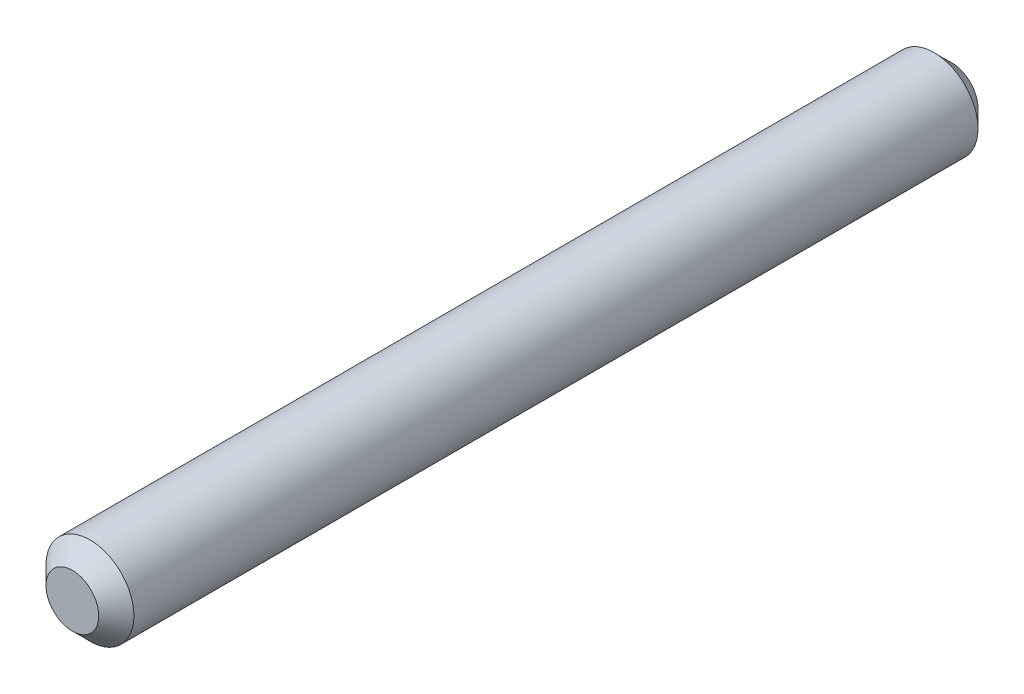
ISO-10303-21;
HEADER;
FILE_DESCRIPTION(('STEP AP214'),'2;1');
FILE_NAME('part.step','',(''),(''),'','','');
FILE_SCHEMA(('AUTOMOTIVE_DESIGN { 1 0 10303 214 1 1 1 1 }'));
ENDSEC;
DATA;
#1=APPLICATION_CONTEXT('core data for automotive mechanical design processes');
#2=APPLICATION_PROTOCOL_DEFINITION('international standard','automotive_design',2000,#1);
#3=PRODUCT_CONTEXT('',#1,'mechanical');
#4=PRODUCT('Part','Part','',(#3));
#5=PRODUCT_RELATED_PRODUCT_CATEGORY('part','',(#4));
#6=PRODUCT_DEFINITION_FORMATION('','',#4);
#7=PRODUCT_DEFINITION_CONTEXT('part definition',#1,'design');
#8=PRODUCT_DEFINITION('design','',#6,#7);
#9=PRODUCT_DEFINITION_SHAPE('','',#8);
#10=(LENGTH_UNIT() NAMED_UNIT(*) SI_UNIT(.MILLI.,.METRE.));
#11=(NAMED_UNIT(*) PLANE_ANGLE_UNIT() SI_UNIT($,.RADIAN.));
#12=(NAMED_UNIT(*) SI_UNIT($,.STERADIAN.) SOLID_ANGLE_UNIT());
#13=UNCERTAINTY_MEASURE_WITH_UNIT(LENGTH_MEASURE(1.E-05),#10,'distance_accuracy_value','');
#14=(GEOMETRIC_REPRESENTATION_CONTEXT(3) GLOBAL_UNCERTAINTY_ASSIGNED_CONTEXT((#13)) GLOBAL_UNIT_ASSIGNED_CONTEXT((#10,
#11,#12)) REPRESENTATION_CONTEXT('',''));
#15=CARTESIAN_POINT('',(0.,0.,0.));
#16=DIRECTION('',(0.,0.,1.));
#17=DIRECTION('',(1.,0.,0.));
#18=AXIS2_PLACEMENT_3D('',#15,#16,#17);
#19=CARTESIAN_POINT('',(0.,0.,-127.));
#20=DIRECTION('',(0.,0.,1.));
#21=DIRECTION('',(1.,0.,0.));
#22=AXIS2_PLACEMENT_3D('',#19,#20,#21);
#23=CYLINDRICAL_SURFACE('',#22,6.35);
#24=CARTESIAN_POINT('',(0.,0.,-124.46));
#25=DIRECTION('',(0.,0.,1.));
#26=DIRECTION('',(1.,0.,0.));
#27=AXIS2_PLACEMENT_3D('',#24,#25,#26);
#28=CIRCLE('',#27,6.35);
#29=CARTESIAN_POINT('',(6.35,0.,-124.46));
#30=VERTEX_POINT('',#29);
#31=EDGE_CURVE('E44',#30,#30,#28,.T.);
#32=ORIENTED_EDGE('',*,*,#31,.T.);
#33=EDGE_LOOP('',(#32));
#34=FACE_BOUND('',#33,.T.);
#35=CARTESIAN_POINT('',(0.,0.,-2.54000000000001));
#36=DIRECTION('',(0.,0.,1.));
#37=DIRECTION('',(1.,0.,0.));
#38=AXIS2_PLACEMENT_3D('',#35,#36,#37);
#39=CIRCLE('',#38,6.35);
#40=CARTESIAN_POINT('',(6.35,0.,-2.54000000000001));
#41=VERTEX_POINT('',#40);
#42=EDGE_CURVE('E48',#41,#41,#39,.F.);
#43=ORIENTED_EDGE('',*,*,#42,.T.);
#44=EDGE_LOOP('',(#43));
#45=FACE_BOUND('',#44,.T.);
#46=ADVANCED_FACE('F33',(#34,#45),#23,.T.);
#47=CARTESIAN_POINT('',(0.,0.,-127.));
#48=DIRECTION('',(0.,0.,1.));
#49=DIRECTION('',(1.,0.,0.));
#50=AXIS2_PLACEMENT_3D('',#47,#48,#49);
#51=PLANE('',#50);
#52=CARTESIAN_POINT('',(0.,0.,-127.));
#53=DIRECTION('',(0.,0.,1.));
#54=DIRECTION('',(1.,0.,0.));
#55=AXIS2_PLACEMENT_3D('',#52,#53,#54);
#56=CIRCLE('',#55,3.80999999999999);
#57=CARTESIAN_POINT('',(3.80999999999999,0.,-127.));
#58=VERTEX_POINT('',#57);
#59=EDGE_CURVE('E40',#58,#58,#56,.F.);
#60=ORIENTED_EDGE('',*,*,#59,.T.);
#61=EDGE_LOOP('',(#60));
#62=FACE_BOUND('',#61,.T.);
#63=ADVANCED_FACE('F64',(#62),#51,.F.);
#64=CARTESIAN_POINT('',(0.,0.,0.));
#65=DIRECTION('',(0.,0.,1.));
#66=DIRECTION('',(1.,0.,0.));
#67=AXIS2_PLACEMENT_3D('',#64,#65,#66);
#68=PLANE('',#67);
#69=CARTESIAN_POINT('',(0.,0.,0.));
#70=DIRECTION('',(0.,0.,1.));
#71=DIRECTION('',(1.,0.,0.));
#72=AXIS2_PLACEMENT_3D('',#69,#70,#71);
#73=CIRCLE('',#72,3.80999999999999);
#74=CARTESIAN_POINT('',(3.80999999999999,0.,0.));
#75=VERTEX_POINT('',#74);
#76=EDGE_CURVE('E10',#75,#75,#73,.T.);
#77=ORIENTED_EDGE('',*,*,#76,.T.);
#78=EDGE_LOOP('',(#77));
#79=FACE_BOUND('',#78,.T.);
#80=ADVANCED_FACE('F61',(#79),#68,.T.);
#81=CARTESIAN_POINT('',(0.,0.,-124.46));
#82=DIRECTION('',(0.,0.,1.));
#83=DIRECTION('',(1.,0.,0.));
#84=AXIS2_PLACEMENT_3D('',#81,#82,#83);
#85=CONICAL_SURFACE('',#84,6.35,0.785398163397441);
#86=ORIENTED_EDGE('',*,*,#59,.F.);
#87=EDGE_LOOP('',(#86));
#88=FACE_BOUND('',#87,.T.);
#89=ORIENTED_EDGE('',*,*,#31,.F.);
#90=EDGE_LOOP('',(#89));
#91=FACE_BOUND('',#90,.T.);
#92=ADVANCED_FACE('F57',(#88,#91),#85,.T.);
#93=CARTESIAN_POINT('',(0.,0.,0.));
#94=DIRECTION('',(0.,0.,-1.));
#95=DIRECTION('',(-1.,0.,0.));
#96=AXIS2_PLACEMENT_3D('',#93,#94,#95);
#97=CONICAL_SURFACE('',#96,3.80999999999999,0.785398163397447);
#98=ORIENTED_EDGE('',*,*,#42,.F.);
#99=EDGE_LOOP('',(#98));
#100=FACE_BOUND('',#99,.T.);
#101=ORIENTED_EDGE('',*,*,#76,.F.);
#102=EDGE_LOOP('',(#101));
#103=FACE_BOUND('',#102,.T.);
#104=ADVANCED_FACE('F35',(#100,#103),#97,.T.);
#105=CLOSED_SHELL('',(#46,#63,#80,#92,#104));
#106=MANIFOLD_SOLID_BREP('B2',#105);
#107=ADVANCED_BREP_SHAPE_REPRESENTATION('',(#18,#106),#14);
#108=SHAPE_DEFINITION_REPRESENTATION(#9,#107);
ENDSEC;
END-ISO-10303-21;
